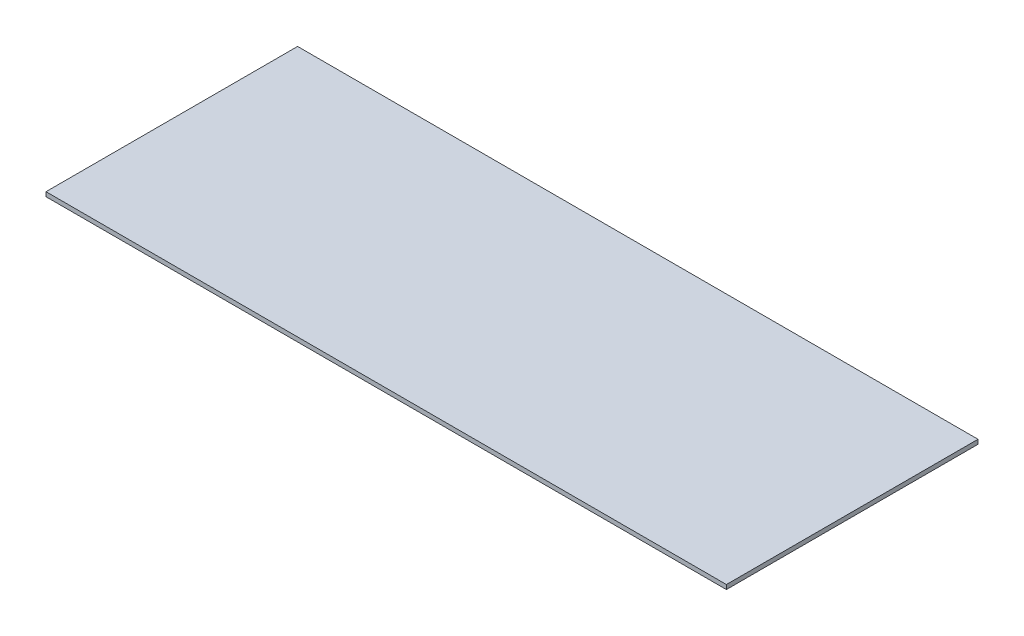
ISO-10303-21;
HEADER;
FILE_DESCRIPTION(('STEP AP214'),'2;1');
FILE_NAME('part.step','',(''),(''),'','','');
FILE_SCHEMA(('AUTOMOTIVE_DESIGN { 1 0 10303 214 1 1 1 1 }'));
ENDSEC;
DATA;
#1=APPLICATION_CONTEXT('core data for automotive mechanical design processes');
#2=APPLICATION_PROTOCOL_DEFINITION('international standard','automotive_design',2000,#1);
#3=PRODUCT_CONTEXT('',#1,'mechanical');
#4=PRODUCT('Part','Part','',(#3));
#5=PRODUCT_RELATED_PRODUCT_CATEGORY('part','',(#4));
#6=PRODUCT_DEFINITION_FORMATION('','',#4);
#7=PRODUCT_DEFINITION_CONTEXT('part definition',#1,'design');
#8=PRODUCT_DEFINITION('design','',#6,#7);
#9=PRODUCT_DEFINITION_SHAPE('','',#8);
#10=(LENGTH_UNIT() NAMED_UNIT(*) SI_UNIT(.MILLI.,.METRE.));
#11=(NAMED_UNIT(*) PLANE_ANGLE_UNIT() SI_UNIT($,.RADIAN.));
#12=(NAMED_UNIT(*) SI_UNIT($,.STERADIAN.) SOLID_ANGLE_UNIT());
#13=UNCERTAINTY_MEASURE_WITH_UNIT(LENGTH_MEASURE(1.E-05),#10,'distance_accuracy_value','');
#14=(GEOMETRIC_REPRESENTATION_CONTEXT(3) GLOBAL_UNCERTAINTY_ASSIGNED_CONTEXT((#13)) GLOBAL_UNIT_ASSIGNED_CONTEXT((#10,
#11,#12)) REPRESENTATION_CONTEXT('',''));
#15=CARTESIAN_POINT('',(0.,0.,0.));
#16=DIRECTION('',(0.,0.,1.));
#17=DIRECTION('',(1.,0.,0.));
#18=AXIS2_PLACEMENT_3D('',#15,#16,#17);
#19=CARTESIAN_POINT('',(0.,2.,0.));
#20=DIRECTION('',(1.,0.,0.));
#21=DIRECTION('',(0.,0.,-1.));
#22=AXIS2_PLACEMENT_3D('',#19,#20,#21);
#23=PLANE('',#22);
#24=DIRECTION('',(0.,0.,1.));
#25=VECTOR('',#24,1.);
#26=CARTESIAN_POINT('',(0.,0.,0.));
#27=LINE('',#26,#25);
#28=CARTESIAN_POINT('',(0.,0.,-115.));
#29=VERTEX_POINT('',#28);
#30=CARTESIAN_POINT('',(0.,0.,0.));
#31=VERTEX_POINT('',#30);
#32=EDGE_CURVE('E107',#29,#31,#27,.T.);
#33=ORIENTED_EDGE('',*,*,#32,.T.);
#34=DIRECTION('',(0.,-1.,0.));
#35=VECTOR('',#34,1.);
#36=CARTESIAN_POINT('',(0.,2.,0.));
#37=LINE('',#36,#35);
#38=CARTESIAN_POINT('',(0.,2.,0.));
#39=VERTEX_POINT('',#38);
#40=EDGE_CURVE('E11',#39,#31,#37,.T.);
#41=ORIENTED_EDGE('',*,*,#40,.F.);
#42=DIRECTION('',(0.,0.,1.));
#43=VECTOR('',#42,1.);
#44=CARTESIAN_POINT('',(0.,2.,0.));
#45=LINE('',#44,#43);
#46=CARTESIAN_POINT('',(0.,2.,-115.));
#47=VERTEX_POINT('',#46);
#48=EDGE_CURVE('E91',#47,#39,#45,.T.);
#49=ORIENTED_EDGE('',*,*,#48,.F.);
#50=DIRECTION('',(0.,-1.,0.));
#51=VECTOR('',#50,1.);
#52=CARTESIAN_POINT('',(0.,2.,-115.));
#53=LINE('',#52,#51);
#54=EDGE_CURVE('E103',#47,#29,#53,.T.);
#55=ORIENTED_EDGE('',*,*,#54,.T.);
#56=EDGE_LOOP('',(#33,#41,#49,#55));
#57=FACE_BOUND('',#56,.T.);
#58=ADVANCED_FACE('F39',(#57),#23,.F.);
#59=CARTESIAN_POINT('',(0.,2.,0.));
#60=DIRECTION('',(0.,0.,-1.));
#61=DIRECTION('',(-1.,0.,0.));
#62=AXIS2_PLACEMENT_3D('',#59,#60,#61);
#63=PLANE('',#62);
#64=DIRECTION('',(1.,0.,0.));
#65=VECTOR('',#64,1.);
#66=CARTESIAN_POINT('',(0.,0.,0.));
#67=LINE('',#66,#65);
#68=CARTESIAN_POINT('',(311.,0.,0.));
#69=VERTEX_POINT('',#68);
#70=EDGE_CURVE('E96',#31,#69,#67,.T.);
#71=ORIENTED_EDGE('',*,*,#70,.T.);
#72=DIRECTION('',(0.,-1.,0.));
#73=VECTOR('',#72,1.);
#74=CARTESIAN_POINT('',(311.,2.,0.));
#75=LINE('',#74,#73);
#76=CARTESIAN_POINT('',(311.,2.,0.));
#77=VERTEX_POINT('',#76);
#78=EDGE_CURVE('E48',#77,#69,#75,.T.);
#79=ORIENTED_EDGE('',*,*,#78,.F.);
#80=DIRECTION('',(1.,0.,0.));
#81=VECTOR('',#80,1.);
#82=CARTESIAN_POINT('',(0.,2.,0.));
#83=LINE('',#82,#81);
#84=EDGE_CURVE('E86',#39,#77,#83,.T.);
#85=ORIENTED_EDGE('',*,*,#84,.F.);
#86=ORIENTED_EDGE('',*,*,#40,.T.);
#87=EDGE_LOOP('',(#71,#79,#85,#86));
#88=FACE_BOUND('',#87,.T.);
#89=ADVANCED_FACE('F95',(#88),#63,.F.);
#90=CARTESIAN_POINT('',(311.,2.,0.));
#91=DIRECTION('',(-1.,0.,0.));
#92=DIRECTION('',(0.,0.,1.));
#93=AXIS2_PLACEMENT_3D('',#90,#91,#92);
#94=PLANE('',#93);
#95=DIRECTION('',(0.,0.,-1.));
#96=VECTOR('',#95,1.);
#97=CARTESIAN_POINT('',(311.,0.,0.));
#98=LINE('',#97,#96);
#99=CARTESIAN_POINT('',(311.,0.,-115.));
#100=VERTEX_POINT('',#99);
#101=EDGE_CURVE('E73',#69,#100,#98,.T.);
#102=ORIENTED_EDGE('',*,*,#101,.T.);
#103=DIRECTION('',(0.,-1.,0.));
#104=VECTOR('',#103,1.);
#105=CARTESIAN_POINT('',(311.,2.,-115.));
#106=LINE('',#105,#104);
#107=CARTESIAN_POINT('',(311.,2.,-115.));
#108=VERTEX_POINT('',#107);
#109=EDGE_CURVE('E98',#108,#100,#106,.T.);
#110=ORIENTED_EDGE('',*,*,#109,.F.);
#111=DIRECTION('',(0.,0.,-1.));
#112=VECTOR('',#111,1.);
#113=CARTESIAN_POINT('',(311.,2.,0.));
#114=LINE('',#113,#112);
#115=EDGE_CURVE('E89',#77,#108,#114,.T.);
#116=ORIENTED_EDGE('',*,*,#115,.F.);
#117=ORIENTED_EDGE('',*,*,#78,.T.);
#118=EDGE_LOOP('',(#102,#110,#116,#117));
#119=FACE_BOUND('',#118,.T.);
#120=ADVANCED_FACE('F99',(#119),#94,.F.);
#121=CARTESIAN_POINT('',(0.,2.,-115.));
#122=DIRECTION('',(0.,0.,1.));
#123=DIRECTION('',(1.,0.,0.));
#124=AXIS2_PLACEMENT_3D('',#121,#122,#123);
#125=PLANE('',#124);
#126=DIRECTION('',(-1.,0.,0.));
#127=VECTOR('',#126,1.);
#128=CARTESIAN_POINT('',(0.,0.,-115.));
#129=LINE('',#128,#127);
#130=EDGE_CURVE('E79',#100,#29,#129,.T.);
#131=ORIENTED_EDGE('',*,*,#130,.T.);
#132=ORIENTED_EDGE('',*,*,#54,.F.);
#133=DIRECTION('',(-1.,0.,0.));
#134=VECTOR('',#133,1.);
#135=CARTESIAN_POINT('',(0.,2.,-115.));
#136=LINE('',#135,#134);
#137=EDGE_CURVE('E56',#108,#47,#136,.T.);
#138=ORIENTED_EDGE('',*,*,#137,.F.);
#139=ORIENTED_EDGE('',*,*,#109,.T.);
#140=EDGE_LOOP('',(#131,#132,#138,#139));
#141=FACE_BOUND('',#140,.T.);
#142=ADVANCED_FACE('F120',(#141),#125,.F.);
#143=CARTESIAN_POINT('',(0.,2.,0.));
#144=DIRECTION('',(0.,-1.,0.));
#145=DIRECTION('',(0.,0.,-1.));
#146=AXIS2_PLACEMENT_3D('',#143,#144,#145);
#147=PLANE('',#146);
#148=ORIENTED_EDGE('',*,*,#48,.T.);
#149=ORIENTED_EDGE('',*,*,#84,.T.);
#150=ORIENTED_EDGE('',*,*,#115,.T.);
#151=ORIENTED_EDGE('',*,*,#137,.T.);
#152=EDGE_LOOP('',(#148,#149,#150,#151));
#153=FACE_BOUND('',#152,.T.);
#154=ADVANCED_FACE('F87',(#153),#147,.F.);
#155=CARTESIAN_POINT('',(0.,0.,0.));
#156=DIRECTION('',(0.,-1.,0.));
#157=DIRECTION('',(0.,0.,-1.));
#158=AXIS2_PLACEMENT_3D('',#155,#156,#157);
#159=PLANE('',#158);
#160=ORIENTED_EDGE('',*,*,#32,.F.);
#161=ORIENTED_EDGE('',*,*,#130,.F.);
#162=ORIENTED_EDGE('',*,*,#101,.F.);
#163=ORIENTED_EDGE('',*,*,#70,.F.);
#164=EDGE_LOOP('',(#160,#161,#162,#163));
#165=FACE_BOUND('',#164,.T.);
#166=ADVANCED_FACE('F123',(#165),#159,.T.);
#167=CLOSED_SHELL('',(#58,#89,#120,#142,#154,#166));
#168=MANIFOLD_SOLID_BREP('B2',#167);
#169=ADVANCED_BREP_SHAPE_REPRESENTATION('',(#18,#168),#14);
#170=SHAPE_DEFINITION_REPRESENTATION(#9,#169);
ENDSEC;
END-ISO-10303-21;
